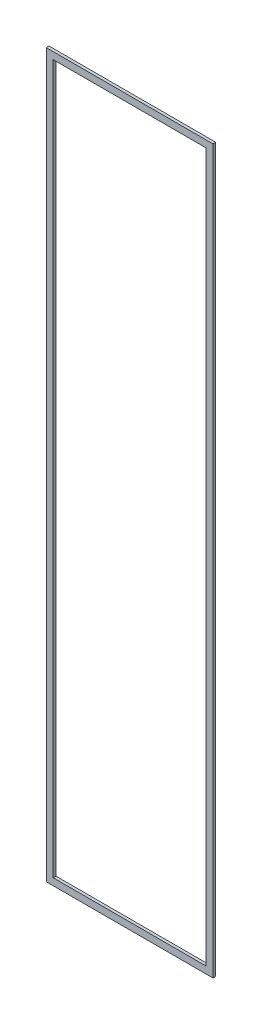
ISO-10303-21;
HEADER;
FILE_DESCRIPTION(('STEP AP214'),'2;1');
FILE_NAME('part.step','',(''),(''),'','','');
FILE_SCHEMA(('AUTOMOTIVE_DESIGN { 1 0 10303 214 1 1 1 1 }'));
ENDSEC;
DATA;
#1=APPLICATION_CONTEXT('core data for automotive mechanical design processes');
#2=APPLICATION_PROTOCOL_DEFINITION('international standard','automotive_design',2000,#1);
#3=PRODUCT_CONTEXT('',#1,'mechanical');
#4=PRODUCT('Part','Part','',(#3));
#5=PRODUCT_RELATED_PRODUCT_CATEGORY('part','',(#4));
#6=PRODUCT_DEFINITION_FORMATION('','',#4);
#7=PRODUCT_DEFINITION_CONTEXT('part definition',#1,'design');
#8=PRODUCT_DEFINITION('design','',#6,#7);
#9=PRODUCT_DEFINITION_SHAPE('','',#8);
#10=(LENGTH_UNIT() NAMED_UNIT(*) SI_UNIT(.MILLI.,.METRE.));
#11=(NAMED_UNIT(*) PLANE_ANGLE_UNIT() SI_UNIT($,.RADIAN.));
#12=(NAMED_UNIT(*) SI_UNIT($,.STERADIAN.) SOLID_ANGLE_UNIT());
#13=UNCERTAINTY_MEASURE_WITH_UNIT(LENGTH_MEASURE(1.E-05),#10,'distance_accuracy_value','');
#14=(GEOMETRIC_REPRESENTATION_CONTEXT(3) GLOBAL_UNCERTAINTY_ASSIGNED_CONTEXT((#13)) GLOBAL_UNIT_ASSIGNED_CONTEXT((#10,
#11,#12)) REPRESENTATION_CONTEXT('',''));
#15=CARTESIAN_POINT('',(0.,0.,0.));
#16=DIRECTION('',(0.,0.,1.));
#17=DIRECTION('',(1.,0.,0.));
#18=AXIS2_PLACEMENT_3D('',#15,#16,#17);
#19=CARTESIAN_POINT('',(0.,0.,10.));
#20=DIRECTION('',(0.,0.,1.));
#21=DIRECTION('',(1.,0.,0.));
#22=AXIS2_PLACEMENT_3D('',#19,#20,#21);
#23=PLANE('',#22);
#24=DIRECTION('',(0.,-1.,0.));
#25=VECTOR('',#24,1.);
#26=CARTESIAN_POINT('',(-300.,-1300.,10.));
#27=LINE('',#26,#25);
#28=CARTESIAN_POINT('',(-300.,1300.,10.));
#29=VERTEX_POINT('',#28);
#30=CARTESIAN_POINT('',(-300.,-1300.,10.));
#31=VERTEX_POINT('',#30);
#32=EDGE_CURVE('E134',#29,#31,#27,.T.);
#33=ORIENTED_EDGE('',*,*,#32,.T.);
#34=DIRECTION('',(1.,0.,0.));
#35=VECTOR('',#34,1.);
#36=CARTESIAN_POINT('',(300.,-1300.,10.));
#37=LINE('',#36,#35);
#38=CARTESIAN_POINT('',(300.,-1300.,10.));
#39=VERTEX_POINT('',#38);
#40=EDGE_CURVE('E137',#31,#39,#37,.T.);
#41=ORIENTED_EDGE('',*,*,#40,.T.);
#42=DIRECTION('',(0.,1.,0.));
#43=VECTOR('',#42,1.);
#44=CARTESIAN_POINT('',(300.,-1300.,10.));
#45=LINE('',#44,#43);
#46=CARTESIAN_POINT('',(300.,1300.,10.));
#47=VERTEX_POINT('',#46);
#48=EDGE_CURVE('E140',#39,#47,#45,.T.);
#49=ORIENTED_EDGE('',*,*,#48,.T.);
#50=DIRECTION('',(-1.,0.,0.));
#51=VECTOR('',#50,1.);
#52=CARTESIAN_POINT('',(300.,1300.,10.));
#53=LINE('',#52,#51);
#54=EDGE_CURVE('E142',#47,#29,#53,.T.);
#55=ORIENTED_EDGE('',*,*,#54,.T.);
#56=EDGE_LOOP('',(#33,#41,#49,#55));
#57=FACE_BOUND('',#56,.T.);
#58=DIRECTION('',(1.,0.,0.));
#59=VECTOR('',#58,1.);
#60=CARTESIAN_POINT('',(275.,-1275.,10.));
#61=LINE('',#60,#59);
#62=CARTESIAN_POINT('',(-275.,-1275.,10.));
#63=VERTEX_POINT('',#62);
#64=CARTESIAN_POINT('',(275.,-1275.,10.));
#65=VERTEX_POINT('',#64);
#66=EDGE_CURVE('E106',#63,#65,#61,.T.);
#67=ORIENTED_EDGE('',*,*,#66,.F.);
#68=DIRECTION('',(0.,-1.,0.));
#69=VECTOR('',#68,1.);
#70=CARTESIAN_POINT('',(-275.,-1275.,10.));
#71=LINE('',#70,#69);
#72=CARTESIAN_POINT('',(-275.,1275.,10.));
#73=VERTEX_POINT('',#72);
#74=EDGE_CURVE('E98',#73,#63,#71,.T.);
#75=ORIENTED_EDGE('',*,*,#74,.F.);
#76=DIRECTION('',(-1.,0.,0.));
#77=VECTOR('',#76,1.);
#78=CARTESIAN_POINT('',(275.,1275.,10.));
#79=LINE('',#78,#77);
#80=CARTESIAN_POINT('',(275.,1275.,10.));
#81=VERTEX_POINT('',#80);
#82=EDGE_CURVE('E120',#81,#73,#79,.T.);
#83=ORIENTED_EDGE('',*,*,#82,.F.);
#84=DIRECTION('',(0.,1.,0.));
#85=VECTOR('',#84,1.);
#86=CARTESIAN_POINT('',(275.,-1275.,10.));
#87=LINE('',#86,#85);
#88=EDGE_CURVE('E118',#65,#81,#87,.T.);
#89=ORIENTED_EDGE('',*,*,#88,.F.);
#90=EDGE_LOOP('',(#67,#75,#83,#89));
#91=FACE_BOUND('',#90,.T.);
#92=ADVANCED_FACE('F33',(#57,#91),#23,.T.);
#93=CARTESIAN_POINT('',(0.,0.,0.));
#94=DIRECTION('',(0.,0.,1.));
#95=DIRECTION('',(1.,0.,0.));
#96=AXIS2_PLACEMENT_3D('',#93,#94,#95);
#97=PLANE('',#96);
#98=DIRECTION('',(0.,-1.,0.));
#99=VECTOR('',#98,1.);
#100=CARTESIAN_POINT('',(-300.,-1300.,0.));
#101=LINE('',#100,#99);
#102=CARTESIAN_POINT('',(-300.,1300.,0.));
#103=VERTEX_POINT('',#102);
#104=CARTESIAN_POINT('',(-300.,-1300.,0.));
#105=VERTEX_POINT('',#104);
#106=EDGE_CURVE('E114',#103,#105,#101,.T.);
#107=ORIENTED_EDGE('',*,*,#106,.F.);
#108=DIRECTION('',(-1.,0.,0.));
#109=VECTOR('',#108,1.);
#110=CARTESIAN_POINT('',(300.,1300.,0.));
#111=LINE('',#110,#109);
#112=CARTESIAN_POINT('',(300.,1300.,0.));
#113=VERTEX_POINT('',#112);
#114=EDGE_CURVE('E138',#113,#103,#111,.T.);
#115=ORIENTED_EDGE('',*,*,#114,.F.);
#116=DIRECTION('',(0.,1.,0.));
#117=VECTOR('',#116,1.);
#118=CARTESIAN_POINT('',(300.,-1300.,0.));
#119=LINE('',#118,#117);
#120=CARTESIAN_POINT('',(300.,-1300.,0.));
#121=VERTEX_POINT('',#120);
#122=EDGE_CURVE('E149',#121,#113,#119,.T.);
#123=ORIENTED_EDGE('',*,*,#122,.F.);
#124=DIRECTION('',(1.,0.,0.));
#125=VECTOR('',#124,1.);
#126=CARTESIAN_POINT('',(300.,-1300.,0.));
#127=LINE('',#126,#125);
#128=EDGE_CURVE('E147',#105,#121,#127,.T.);
#129=ORIENTED_EDGE('',*,*,#128,.F.);
#130=EDGE_LOOP('',(#107,#115,#123,#129));
#131=FACE_BOUND('',#130,.T.);
#132=DIRECTION('',(0.,-1.,0.));
#133=VECTOR('',#132,1.);
#134=CARTESIAN_POINT('',(-275.,-1275.,0.));
#135=LINE('',#134,#133);
#136=CARTESIAN_POINT('',(-275.,1275.,0.));
#137=VERTEX_POINT('',#136);
#138=CARTESIAN_POINT('',(-275.,-1275.,0.));
#139=VERTEX_POINT('',#138);
#140=EDGE_CURVE('E56',#137,#139,#135,.T.);
#141=ORIENTED_EDGE('',*,*,#140,.T.);
#142=DIRECTION('',(1.,0.,0.));
#143=VECTOR('',#142,1.);
#144=CARTESIAN_POINT('',(275.,-1275.,0.));
#145=LINE('',#144,#143);
#146=CARTESIAN_POINT('',(275.,-1275.,0.));
#147=VERTEX_POINT('',#146);
#148=EDGE_CURVE('E113',#139,#147,#145,.T.);
#149=ORIENTED_EDGE('',*,*,#148,.T.);
#150=DIRECTION('',(0.,1.,0.));
#151=VECTOR('',#150,1.);
#152=CARTESIAN_POINT('',(275.,-1275.,0.));
#153=LINE('',#152,#151);
#154=CARTESIAN_POINT('',(275.,1275.,0.));
#155=VERTEX_POINT('',#154);
#156=EDGE_CURVE('E126',#147,#155,#153,.T.);
#157=ORIENTED_EDGE('',*,*,#156,.T.);
#158=DIRECTION('',(-1.,0.,0.));
#159=VECTOR('',#158,1.);
#160=CARTESIAN_POINT('',(275.,1275.,0.));
#161=LINE('',#160,#159);
#162=EDGE_CURVE('E107',#155,#137,#161,.T.);
#163=ORIENTED_EDGE('',*,*,#162,.T.);
#164=EDGE_LOOP('',(#141,#149,#157,#163));
#165=FACE_BOUND('',#164,.T.);
#166=ADVANCED_FACE('F167',(#131,#165),#97,.F.);
#167=CARTESIAN_POINT('',(-300.,-1300.,10.));
#168=DIRECTION('',(1.,0.,0.));
#169=DIRECTION('',(0.,0.,-1.));
#170=AXIS2_PLACEMENT_3D('',#167,#168,#169);
#171=PLANE('',#170);
#172=ORIENTED_EDGE('',*,*,#106,.T.);
#173=DIRECTION('',(0.,0.,-1.));
#174=VECTOR('',#173,1.);
#175=CARTESIAN_POINT('',(-300.,-1300.,10.));
#176=LINE('',#175,#174);
#177=EDGE_CURVE('E11',#31,#105,#176,.T.);
#178=ORIENTED_EDGE('',*,*,#177,.F.);
#179=ORIENTED_EDGE('',*,*,#32,.F.);
#180=DIRECTION('',(0.,0.,-1.));
#181=VECTOR('',#180,1.);
#182=CARTESIAN_POINT('',(-300.,1300.,10.));
#183=LINE('',#182,#181);
#184=EDGE_CURVE('E144',#29,#103,#183,.T.);
#185=ORIENTED_EDGE('',*,*,#184,.T.);
#186=EDGE_LOOP('',(#172,#178,#179,#185));
#187=FACE_BOUND('',#186,.T.);
#188=ADVANCED_FACE('F35',(#187),#171,.F.);
#189=CARTESIAN_POINT('',(300.,-1300.,10.));
#190=DIRECTION('',(0.,1.,0.));
#191=DIRECTION('',(0.,0.,1.));
#192=AXIS2_PLACEMENT_3D('',#189,#190,#191);
#193=PLANE('',#192);
#194=ORIENTED_EDGE('',*,*,#128,.T.);
#195=DIRECTION('',(0.,0.,-1.));
#196=VECTOR('',#195,1.);
#197=CARTESIAN_POINT('',(300.,-1300.,10.));
#198=LINE('',#197,#196);
#199=EDGE_CURVE('E41',#39,#121,#198,.T.);
#200=ORIENTED_EDGE('',*,*,#199,.F.);
#201=ORIENTED_EDGE('',*,*,#40,.F.);
#202=ORIENTED_EDGE('',*,*,#177,.T.);
#203=EDGE_LOOP('',(#194,#200,#201,#202));
#204=FACE_BOUND('',#203,.T.);
#205=ADVANCED_FACE('F177',(#204),#193,.F.);
#206=CARTESIAN_POINT('',(300.,-1300.,10.));
#207=DIRECTION('',(-1.,0.,0.));
#208=DIRECTION('',(0.,0.,1.));
#209=AXIS2_PLACEMENT_3D('',#206,#207,#208);
#210=PLANE('',#209);
#211=ORIENTED_EDGE('',*,*,#122,.T.);
#212=DIRECTION('',(0.,0.,-1.));
#213=VECTOR('',#212,1.);
#214=CARTESIAN_POINT('',(300.,1300.,10.));
#215=LINE('',#214,#213);
#216=EDGE_CURVE('E154',#47,#113,#215,.T.);
#217=ORIENTED_EDGE('',*,*,#216,.F.);
#218=ORIENTED_EDGE('',*,*,#48,.F.);
#219=ORIENTED_EDGE('',*,*,#199,.T.);
#220=EDGE_LOOP('',(#211,#217,#218,#219));
#221=FACE_BOUND('',#220,.T.);
#222=ADVANCED_FACE('F161',(#221),#210,.F.);
#223=CARTESIAN_POINT('',(300.,1300.,10.));
#224=DIRECTION('',(0.,-1.,0.));
#225=DIRECTION('',(0.,0.,-1.));
#226=AXIS2_PLACEMENT_3D('',#223,#224,#225);
#227=PLANE('',#226);
#228=ORIENTED_EDGE('',*,*,#114,.T.);
#229=ORIENTED_EDGE('',*,*,#184,.F.);
#230=ORIENTED_EDGE('',*,*,#54,.F.);
#231=ORIENTED_EDGE('',*,*,#216,.T.);
#232=EDGE_LOOP('',(#228,#229,#230,#231));
#233=FACE_BOUND('',#232,.T.);
#234=ADVANCED_FACE('F171',(#233),#227,.F.);
#235=CARTESIAN_POINT('',(-275.,-1275.,10.));
#236=DIRECTION('',(1.,0.,0.));
#237=DIRECTION('',(0.,0.,-1.));
#238=AXIS2_PLACEMENT_3D('',#235,#236,#237);
#239=PLANE('',#238);
#240=ORIENTED_EDGE('',*,*,#140,.F.);
#241=DIRECTION('',(0.,0.,-1.));
#242=VECTOR('',#241,1.);
#243=CARTESIAN_POINT('',(-275.,1275.,10.));
#244=LINE('',#243,#242);
#245=EDGE_CURVE('E102',#73,#137,#244,.T.);
#246=ORIENTED_EDGE('',*,*,#245,.F.);
#247=ORIENTED_EDGE('',*,*,#74,.T.);
#248=DIRECTION('',(0.,0.,-1.));
#249=VECTOR('',#248,1.);
#250=CARTESIAN_POINT('',(-275.,-1275.,10.));
#251=LINE('',#250,#249);
#252=EDGE_CURVE('E101',#63,#139,#251,.T.);
#253=ORIENTED_EDGE('',*,*,#252,.T.);
#254=EDGE_LOOP('',(#240,#246,#247,#253));
#255=FACE_BOUND('',#254,.T.);
#256=ADVANCED_FACE('F100',(#255),#239,.T.);
#257=CARTESIAN_POINT('',(275.,-1275.,10.));
#258=DIRECTION('',(0.,1.,0.));
#259=DIRECTION('',(0.,0.,1.));
#260=AXIS2_PLACEMENT_3D('',#257,#258,#259);
#261=PLANE('',#260);
#262=ORIENTED_EDGE('',*,*,#148,.F.);
#263=ORIENTED_EDGE('',*,*,#252,.F.);
#264=ORIENTED_EDGE('',*,*,#66,.T.);
#265=DIRECTION('',(0.,0.,-1.));
#266=VECTOR('',#265,1.);
#267=CARTESIAN_POINT('',(275.,-1275.,10.));
#268=LINE('',#267,#266);
#269=EDGE_CURVE('E115',#65,#147,#268,.T.);
#270=ORIENTED_EDGE('',*,*,#269,.T.);
#271=EDGE_LOOP('',(#262,#263,#264,#270));
#272=FACE_BOUND('',#271,.T.);
#273=ADVANCED_FACE('F110',(#272),#261,.T.);
#274=CARTESIAN_POINT('',(275.,-1275.,10.));
#275=DIRECTION('',(-1.,0.,0.));
#276=DIRECTION('',(0.,0.,1.));
#277=AXIS2_PLACEMENT_3D('',#274,#275,#276);
#278=PLANE('',#277);
#279=ORIENTED_EDGE('',*,*,#156,.F.);
#280=ORIENTED_EDGE('',*,*,#269,.F.);
#281=ORIENTED_EDGE('',*,*,#88,.T.);
#282=DIRECTION('',(0.,0.,-1.));
#283=VECTOR('',#282,1.);
#284=CARTESIAN_POINT('',(275.,1275.,10.));
#285=LINE('',#284,#283);
#286=EDGE_CURVE('E48',#81,#155,#285,.T.);
#287=ORIENTED_EDGE('',*,*,#286,.T.);
#288=EDGE_LOOP('',(#279,#280,#281,#287));
#289=FACE_BOUND('',#288,.T.);
#290=ADVANCED_FACE('F200',(#289),#278,.T.);
#291=CARTESIAN_POINT('',(275.,1275.,10.));
#292=DIRECTION('',(0.,-1.,0.));
#293=DIRECTION('',(0.,0.,-1.));
#294=AXIS2_PLACEMENT_3D('',#291,#292,#293);
#295=PLANE('',#294);
#296=ORIENTED_EDGE('',*,*,#162,.F.);
#297=ORIENTED_EDGE('',*,*,#286,.F.);
#298=ORIENTED_EDGE('',*,*,#82,.T.);
#299=ORIENTED_EDGE('',*,*,#245,.T.);
#300=EDGE_LOOP('',(#296,#297,#298,#299));
#301=FACE_BOUND('',#300,.T.);
#302=ADVANCED_FACE('F204',(#301),#295,.T.);
#303=CLOSED_SHELL('',(#92,#166,#188,#205,#222,#234,#256,#273,#290,#302));
#304=MANIFOLD_SOLID_BREP('B2',#303);
#305=ADVANCED_BREP_SHAPE_REPRESENTATION('',(#18,#304),#14);
#306=SHAPE_DEFINITION_REPRESENTATION(#9,#305);
ENDSEC;
END-ISO-10303-21;
